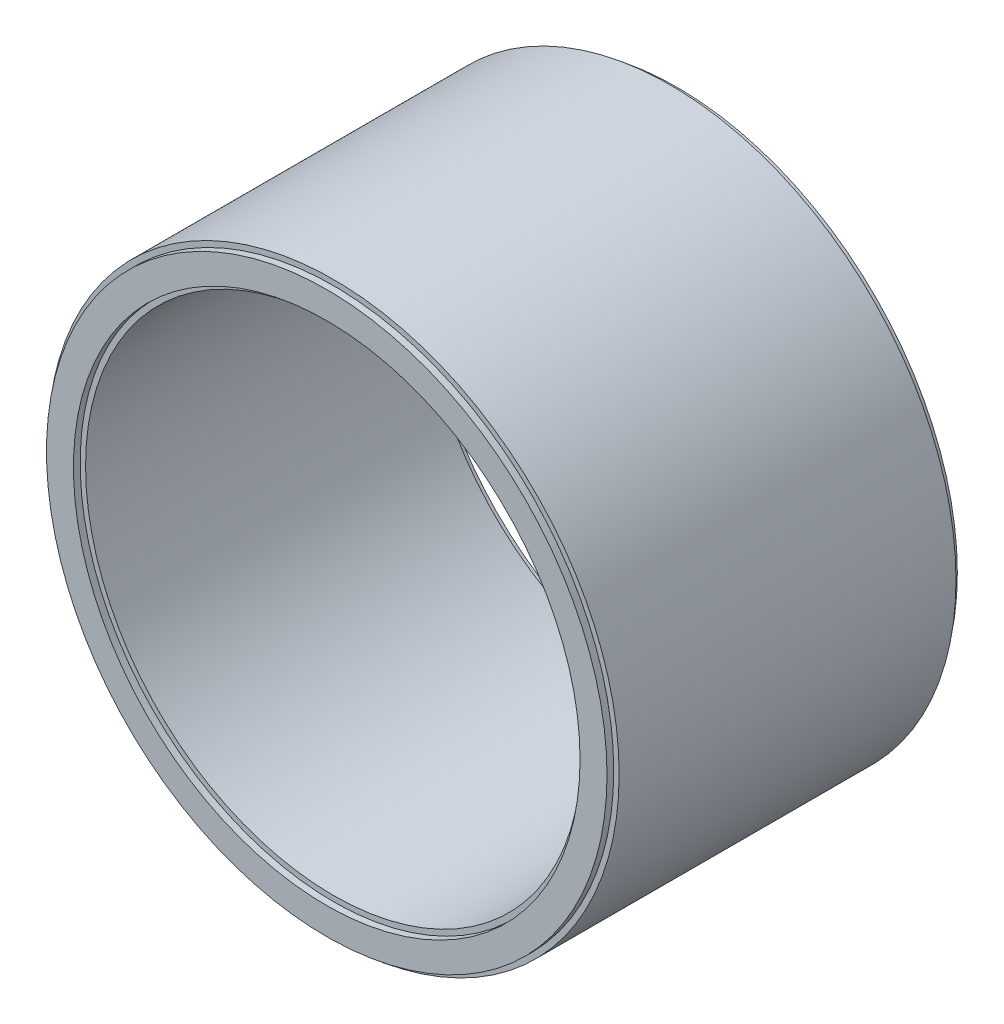
ISO-10303-21;
HEADER;
FILE_DESCRIPTION(('STEP AP214'),'2;1');
FILE_NAME('part.step','',(''),(''),'','','');
FILE_SCHEMA(('AUTOMOTIVE_DESIGN { 1 0 10303 214 1 1 1 1 }'));
ENDSEC;
DATA;
#1=APPLICATION_CONTEXT('core data for automotive mechanical design processes');
#2=APPLICATION_PROTOCOL_DEFINITION('international standard','automotive_design',2000,#1);
#3=PRODUCT_CONTEXT('',#1,'mechanical');
#4=PRODUCT('Part','Part','',(#3));
#5=PRODUCT_RELATED_PRODUCT_CATEGORY('part','',(#4));
#6=PRODUCT_DEFINITION_FORMATION('','',#4);
#7=PRODUCT_DEFINITION_CONTEXT('part definition',#1,'design');
#8=PRODUCT_DEFINITION('design','',#6,#7);
#9=PRODUCT_DEFINITION_SHAPE('','',#8);
#10=(LENGTH_UNIT() NAMED_UNIT(*) SI_UNIT(.MILLI.,.METRE.));
#11=(NAMED_UNIT(*) PLANE_ANGLE_UNIT() SI_UNIT($,.RADIAN.));
#12=(NAMED_UNIT(*) SI_UNIT($,.STERADIAN.) SOLID_ANGLE_UNIT());
#13=UNCERTAINTY_MEASURE_WITH_UNIT(LENGTH_MEASURE(1.E-05),#10,'distance_accuracy_value','');
#14=(GEOMETRIC_REPRESENTATION_CONTEXT(3) GLOBAL_UNCERTAINTY_ASSIGNED_CONTEXT((#13)) GLOBAL_UNIT_ASSIGNED_CONTEXT((#10,
#11,#12)) REPRESENTATION_CONTEXT('',''));
#15=CARTESIAN_POINT('',(0.,0.,0.));
#16=DIRECTION('',(0.,0.,1.));
#17=DIRECTION('',(1.,0.,0.));
#18=AXIS2_PLACEMENT_3D('',#15,#16,#17);
#19=CARTESIAN_POINT('',(0.,9.4,6.5));
#20=DIRECTION('',(0.,0.,-1.));
#21=DIRECTION('',(-1.,0.,0.));
#22=AXIS2_PLACEMENT_3D('',#19,#20,#21);
#23=PLANE('',#22);
#24=CARTESIAN_POINT('',(0.,0.,6.5));
#25=DIRECTION('',(0.,0.,1.));
#26=DIRECTION('',(1.,0.,0.));
#27=AXIS2_PLACEMENT_3D('',#24,#25,#26);
#28=CIRCLE('',#27,9.4);
#29=CARTESIAN_POINT('',(9.4,0.,6.5));
#30=VERTEX_POINT('',#29);
#31=EDGE_CURVE('E71',#30,#30,#28,.T.);
#32=ORIENTED_EDGE('',*,*,#31,.F.);
#33=EDGE_LOOP('',(#32));
#34=FACE_BOUND('',#33,.T.);
#35=CARTESIAN_POINT('',(0.,0.,6.5));
#36=DIRECTION('',(0.,0.,1.));
#37=DIRECTION('',(1.,0.,0.));
#38=AXIS2_PLACEMENT_3D('',#35,#36,#37);
#39=CIRCLE('',#38,10.4);
#40=CARTESIAN_POINT('',(10.4,0.,6.5));
#41=VERTEX_POINT('',#40);
#42=EDGE_CURVE('E10',#41,#41,#39,.T.);
#43=ORIENTED_EDGE('',*,*,#42,.T.);
#44=EDGE_LOOP('',(#43));
#45=FACE_BOUND('',#44,.T.);
#46=ADVANCED_FACE('F31',(#34,#45),#23,.F.);
#47=CARTESIAN_POINT('',(0.,0.,6.88356418961042));
#48=DIRECTION('',(0.,0.,1.));
#49=DIRECTION('',(1.,0.,0.));
#50=AXIS2_PLACEMENT_3D('',#47,#48,#49);
#51=CYLINDRICAL_SURFACE('',#50,10.4);
#52=ORIENTED_EDGE('',*,*,#42,.F.);
#53=EDGE_LOOP('',(#52));
#54=FACE_BOUND('',#53,.T.);
#55=CARTESIAN_POINT('',(0.,0.,6.25));
#56=DIRECTION('',(0.,0.,1.));
#57=DIRECTION('',(1.,0.,0.));
#58=AXIS2_PLACEMENT_3D('',#55,#56,#57);
#59=CIRCLE('',#58,10.4);
#60=CARTESIAN_POINT('',(10.4,0.,6.25));
#61=VERTEX_POINT('',#60);
#62=EDGE_CURVE('E37',#61,#61,#59,.T.);
#63=ORIENTED_EDGE('',*,*,#62,.T.);
#64=EDGE_LOOP('',(#63));
#65=FACE_BOUND('',#64,.T.);
#66=ADVANCED_FACE('F78',(#54,#65),#51,.T.);
#67=CARTESIAN_POINT('',(0.,10.4,6.25));
#68=DIRECTION('',(0.,0.,-1.));
#69=DIRECTION('',(-1.,0.,0.));
#70=AXIS2_PLACEMENT_3D('',#67,#68,#69);
#71=PLANE('',#70);
#72=ORIENTED_EDGE('',*,*,#62,.F.);
#73=EDGE_LOOP('',(#72));
#74=FACE_BOUND('',#73,.T.);
#75=CARTESIAN_POINT('',(0.,0.,6.25));
#76=DIRECTION('',(0.,0.,1.));
#77=DIRECTION('',(1.,0.,0.));
#78=AXIS2_PLACEMENT_3D('',#75,#76,#77);
#79=CIRCLE('',#78,10.6);
#80=CARTESIAN_POINT('',(10.6,0.,6.25));
#81=VERTEX_POINT('',#80);
#82=EDGE_CURVE('E41',#81,#81,#79,.T.);
#83=ORIENTED_EDGE('',*,*,#82,.T.);
#84=EDGE_LOOP('',(#83));
#85=FACE_BOUND('',#84,.T.);
#86=ADVANCED_FACE('F82',(#74,#85),#71,.F.);
#87=CARTESIAN_POINT('',(0.,0.,6.88356418961042));
#88=DIRECTION('',(0.,0.,1.));
#89=DIRECTION('',(1.,0.,0.));
#90=AXIS2_PLACEMENT_3D('',#87,#88,#89);
#91=CYLINDRICAL_SURFACE('',#90,10.6);
#92=ORIENTED_EDGE('',*,*,#82,.F.);
#93=EDGE_LOOP('',(#92));
#94=FACE_BOUND('',#93,.T.);
#95=CARTESIAN_POINT('',(0.,0.,-6.25));
#96=DIRECTION('',(0.,0.,1.));
#97=DIRECTION('',(1.,0.,0.));
#98=AXIS2_PLACEMENT_3D('',#95,#96,#97);
#99=CIRCLE('',#98,10.6);
#100=CARTESIAN_POINT('',(10.6,0.,-6.25));
#101=VERTEX_POINT('',#100);
#102=EDGE_CURVE('E45',#101,#101,#99,.T.);
#103=ORIENTED_EDGE('',*,*,#102,.T.);
#104=EDGE_LOOP('',(#103));
#105=FACE_BOUND('',#104,.T.);
#106=ADVANCED_FACE('F87',(#94,#105),#91,.T.);
#107=CARTESIAN_POINT('',(0.,10.6,-6.25));
#108=DIRECTION('',(0.,0.,1.));
#109=DIRECTION('',(1.,0.,0.));
#110=AXIS2_PLACEMENT_3D('',#107,#108,#109);
#111=PLANE('',#110);
#112=ORIENTED_EDGE('',*,*,#102,.F.);
#113=EDGE_LOOP('',(#112));
#114=FACE_BOUND('',#113,.T.);
#115=CARTESIAN_POINT('',(0.,0.,-6.25));
#116=DIRECTION('',(0.,0.,1.));
#117=DIRECTION('',(1.,0.,0.));
#118=AXIS2_PLACEMENT_3D('',#115,#116,#117);
#119=CIRCLE('',#118,10.4);
#120=CARTESIAN_POINT('',(10.4,0.,-6.25));
#121=VERTEX_POINT('',#120);
#122=EDGE_CURVE('E50',#121,#121,#119,.T.);
#123=ORIENTED_EDGE('',*,*,#122,.T.);
#124=EDGE_LOOP('',(#123));
#125=FACE_BOUND('',#124,.T.);
#126=ADVANCED_FACE('F93',(#114,#125),#111,.F.);
#127=CARTESIAN_POINT('',(0.,0.,6.88356418961042));
#128=DIRECTION('',(0.,0.,1.));
#129=DIRECTION('',(1.,0.,0.));
#130=AXIS2_PLACEMENT_3D('',#127,#128,#129);
#131=CYLINDRICAL_SURFACE('',#130,10.4);
#132=ORIENTED_EDGE('',*,*,#122,.F.);
#133=EDGE_LOOP('',(#132));
#134=FACE_BOUND('',#133,.T.);
#135=CARTESIAN_POINT('',(0.,0.,-6.5));
#136=DIRECTION('',(0.,0.,1.));
#137=DIRECTION('',(1.,0.,0.));
#138=AXIS2_PLACEMENT_3D('',#135,#136,#137);
#139=CIRCLE('',#138,10.4);
#140=CARTESIAN_POINT('',(10.4,0.,-6.5));
#141=VERTEX_POINT('',#140);
#142=EDGE_CURVE('E53',#141,#141,#139,.T.);
#143=ORIENTED_EDGE('',*,*,#142,.T.);
#144=EDGE_LOOP('',(#143));
#145=FACE_BOUND('',#144,.T.);
#146=ADVANCED_FACE('F97',(#134,#145),#131,.T.);
#147=CARTESIAN_POINT('',(0.,10.4,-6.5));
#148=DIRECTION('',(0.,0.,1.));
#149=DIRECTION('',(1.,0.,0.));
#150=AXIS2_PLACEMENT_3D('',#147,#148,#149);
#151=PLANE('',#150);
#152=ORIENTED_EDGE('',*,*,#142,.F.);
#153=EDGE_LOOP('',(#152));
#154=FACE_BOUND('',#153,.T.);
#155=CARTESIAN_POINT('',(0.,0.,-6.5));
#156=DIRECTION('',(0.,0.,1.));
#157=DIRECTION('',(1.,0.,0.));
#158=AXIS2_PLACEMENT_3D('',#155,#156,#157);
#159=CIRCLE('',#158,9.4);
#160=CARTESIAN_POINT('',(9.4,0.,-6.5));
#161=VERTEX_POINT('',#160);
#162=EDGE_CURVE('E56',#161,#161,#159,.T.);
#163=ORIENTED_EDGE('',*,*,#162,.T.);
#164=EDGE_LOOP('',(#163));
#165=FACE_BOUND('',#164,.T.);
#166=ADVANCED_FACE('F101',(#154,#165),#151,.F.);
#167=CARTESIAN_POINT('',(0.,0.,6.88356418961042));
#168=DIRECTION('',(0.,0.,1.));
#169=DIRECTION('',(1.,0.,0.));
#170=AXIS2_PLACEMENT_3D('',#167,#168,#169);
#171=CYLINDRICAL_SURFACE('',#170,9.4);
#172=ORIENTED_EDGE('',*,*,#162,.F.);
#173=EDGE_LOOP('',(#172));
#174=FACE_BOUND('',#173,.T.);
#175=CARTESIAN_POINT('',(0.,0.,-6.25));
#176=DIRECTION('',(0.,0.,1.));
#177=DIRECTION('',(1.,0.,0.));
#178=AXIS2_PLACEMENT_3D('',#175,#176,#177);
#179=CIRCLE('',#178,9.4);
#180=CARTESIAN_POINT('',(9.4,0.,-6.25));
#181=VERTEX_POINT('',#180);
#182=EDGE_CURVE('E59',#181,#181,#179,.T.);
#183=ORIENTED_EDGE('',*,*,#182,.T.);
#184=EDGE_LOOP('',(#183));
#185=FACE_BOUND('',#184,.T.);
#186=ADVANCED_FACE('F105',(#174,#185),#171,.F.);
#187=CARTESIAN_POINT('',(0.,9.4,-6.25));
#188=DIRECTION('',(0.,0.,1.));
#189=DIRECTION('',(1.,0.,0.));
#190=AXIS2_PLACEMENT_3D('',#187,#188,#189);
#191=PLANE('',#190);
#192=ORIENTED_EDGE('',*,*,#182,.F.);
#193=EDGE_LOOP('',(#192));
#194=FACE_BOUND('',#193,.T.);
#195=CARTESIAN_POINT('',(0.,0.,-6.25));
#196=DIRECTION('',(0.,0.,1.));
#197=DIRECTION('',(1.,0.,0.));
#198=AXIS2_PLACEMENT_3D('',#195,#196,#197);
#199=CIRCLE('',#198,9.2);
#200=CARTESIAN_POINT('',(9.2,0.,-6.25));
#201=VERTEX_POINT('',#200);
#202=EDGE_CURVE('E62',#201,#201,#199,.T.);
#203=ORIENTED_EDGE('',*,*,#202,.T.);
#204=EDGE_LOOP('',(#203));
#205=FACE_BOUND('',#204,.T.);
#206=ADVANCED_FACE('F109',(#194,#205),#191,.F.);
#207=CARTESIAN_POINT('',(0.,0.,6.88356418961042));
#208=DIRECTION('',(0.,0.,1.));
#209=DIRECTION('',(1.,0.,0.));
#210=AXIS2_PLACEMENT_3D('',#207,#208,#209);
#211=CYLINDRICAL_SURFACE('',#210,9.2);
#212=ORIENTED_EDGE('',*,*,#202,.F.);
#213=EDGE_LOOP('',(#212));
#214=FACE_BOUND('',#213,.T.);
#215=CARTESIAN_POINT('',(0.,0.,6.25));
#216=DIRECTION('',(0.,0.,1.));
#217=DIRECTION('',(1.,0.,0.));
#218=AXIS2_PLACEMENT_3D('',#215,#216,#217);
#219=CIRCLE('',#218,9.2);
#220=CARTESIAN_POINT('',(9.2,0.,6.25));
#221=VERTEX_POINT('',#220);
#222=EDGE_CURVE('E65',#221,#221,#219,.T.);
#223=ORIENTED_EDGE('',*,*,#222,.T.);
#224=EDGE_LOOP('',(#223));
#225=FACE_BOUND('',#224,.T.);
#226=ADVANCED_FACE('F113',(#214,#225),#211,.F.);
#227=CARTESIAN_POINT('',(0.,9.2,6.25));
#228=DIRECTION('',(0.,0.,-1.));
#229=DIRECTION('',(-1.,0.,0.));
#230=AXIS2_PLACEMENT_3D('',#227,#228,#229);
#231=PLANE('',#230);
#232=ORIENTED_EDGE('',*,*,#222,.F.);
#233=EDGE_LOOP('',(#232));
#234=FACE_BOUND('',#233,.T.);
#235=CARTESIAN_POINT('',(0.,0.,6.25));
#236=DIRECTION('',(0.,0.,1.));
#237=DIRECTION('',(1.,0.,0.));
#238=AXIS2_PLACEMENT_3D('',#235,#236,#237);
#239=CIRCLE('',#238,9.4);
#240=CARTESIAN_POINT('',(9.4,0.,6.25));
#241=VERTEX_POINT('',#240);
#242=EDGE_CURVE('E68',#241,#241,#239,.T.);
#243=ORIENTED_EDGE('',*,*,#242,.T.);
#244=EDGE_LOOP('',(#243));
#245=FACE_BOUND('',#244,.T.);
#246=ADVANCED_FACE('F117',(#234,#245),#231,.F.);
#247=CARTESIAN_POINT('',(0.,0.,6.88356418961042));
#248=DIRECTION('',(0.,0.,1.));
#249=DIRECTION('',(1.,0.,0.));
#250=AXIS2_PLACEMENT_3D('',#247,#248,#249);
#251=CYLINDRICAL_SURFACE('',#250,9.4);
#252=ORIENTED_EDGE('',*,*,#242,.F.);
#253=EDGE_LOOP('',(#252));
#254=FACE_BOUND('',#253,.T.);
#255=ORIENTED_EDGE('',*,*,#31,.T.);
#256=EDGE_LOOP('',(#255));
#257=FACE_BOUND('',#256,.T.);
#258=ADVANCED_FACE('F75',(#254,#257),#251,.F.);
#259=CLOSED_SHELL('',(#46,#66,#86,#106,#126,#146,#166,#186,#206,#226,#246,#258));
#260=MANIFOLD_SOLID_BREP('B2',#259);
#261=ADVANCED_BREP_SHAPE_REPRESENTATION('',(#18,#260),#14);
#262=SHAPE_DEFINITION_REPRESENTATION(#9,#261);
ENDSEC;
END-ISO-10303-21;
